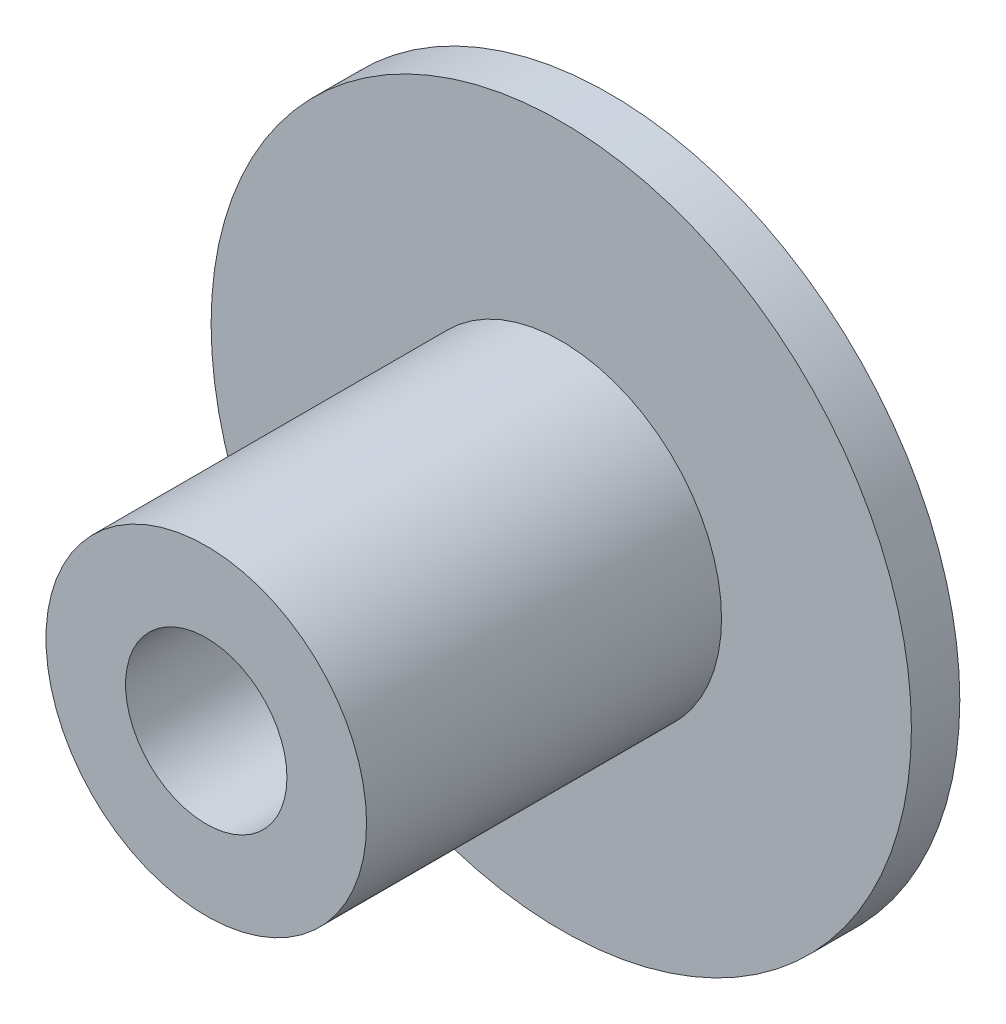
ISO-10303-21;
HEADER;
FILE_DESCRIPTION(('STEP AP214'),'2;1');
FILE_NAME('part.step','',(''),(''),'','','');
FILE_SCHEMA(('AUTOMOTIVE_DESIGN { 1 0 10303 214 1 1 1 1 }'));
ENDSEC;
DATA;
#1=APPLICATION_CONTEXT('core data for automotive mechanical design processes');
#2=APPLICATION_PROTOCOL_DEFINITION('international standard','automotive_design',2000,#1);
#3=PRODUCT_CONTEXT('',#1,'mechanical');
#4=PRODUCT('Part','Part','',(#3));
#5=PRODUCT_RELATED_PRODUCT_CATEGORY('part','',(#4));
#6=PRODUCT_DEFINITION_FORMATION('','',#4);
#7=PRODUCT_DEFINITION_CONTEXT('part definition',#1,'design');
#8=PRODUCT_DEFINITION('design','',#6,#7);
#9=PRODUCT_DEFINITION_SHAPE('','',#8);
#10=(LENGTH_UNIT() NAMED_UNIT(*) SI_UNIT(.MILLI.,.METRE.));
#11=(NAMED_UNIT(*) PLANE_ANGLE_UNIT() SI_UNIT($,.RADIAN.));
#12=(NAMED_UNIT(*) SI_UNIT($,.STERADIAN.) SOLID_ANGLE_UNIT());
#13=UNCERTAINTY_MEASURE_WITH_UNIT(LENGTH_MEASURE(1.E-05),#10,'distance_accuracy_value','');
#14=(GEOMETRIC_REPRESENTATION_CONTEXT(3) GLOBAL_UNCERTAINTY_ASSIGNED_CONTEXT((#13)) GLOBAL_UNIT_ASSIGNED_CONTEXT((#10,
#11,#12)) REPRESENTATION_CONTEXT('',''));
#15=CARTESIAN_POINT('',(0.,0.,0.));
#16=DIRECTION('',(0.,0.,1.));
#17=DIRECTION('',(1.,0.,0.));
#18=AXIS2_PLACEMENT_3D('',#15,#16,#17);
#19=CARTESIAN_POINT('',(0.,0.,4.5));
#20=DIRECTION('',(0.,0.,1.));
#21=DIRECTION('',(1.,0.,0.));
#22=AXIS2_PLACEMENT_3D('',#19,#20,#21);
#23=PLANE('',#22);
#24=CARTESIAN_POINT('',(0.,0.,4.5));
#25=DIRECTION('',(0.,0.,1.));
#26=DIRECTION('',(1.,0.,0.));
#27=AXIS2_PLACEMENT_3D('',#24,#25,#26);
#28=CIRCLE('',#27,32.55);
#29=CARTESIAN_POINT('',(32.55,0.,4.5));
#30=VERTEX_POINT('',#29);
#31=EDGE_CURVE('E10',#30,#30,#28,.T.);
#32=ORIENTED_EDGE('',*,*,#31,.T.);
#33=EDGE_LOOP('',(#32));
#34=FACE_BOUND('',#33,.T.);
#35=CARTESIAN_POINT('',(0.,0.,4.5));
#36=DIRECTION('',(0.,0.,1.));
#37=DIRECTION('',(1.,0.,0.));
#38=AXIS2_PLACEMENT_3D('',#35,#36,#37);
#39=CIRCLE('',#38,14.9);
#40=CARTESIAN_POINT('',(14.9,0.,4.5));
#41=VERTEX_POINT('',#40);
#42=EDGE_CURVE('E49',#41,#41,#39,.T.);
#43=ORIENTED_EDGE('',*,*,#42,.F.);
#44=EDGE_LOOP('',(#43));
#45=FACE_BOUND('',#44,.T.);
#46=ADVANCED_FACE('F33',(#34,#45),#23,.T.);
#47=CARTESIAN_POINT('',(0.,0.,0.));
#48=DIRECTION('',(0.,0.,1.));
#49=DIRECTION('',(1.,0.,0.));
#50=AXIS2_PLACEMENT_3D('',#47,#48,#49);
#51=PLANE('',#50);
#52=CARTESIAN_POINT('',(0.,0.,0.));
#53=DIRECTION('',(0.,0.,1.));
#54=DIRECTION('',(1.,0.,0.));
#55=AXIS2_PLACEMENT_3D('',#52,#53,#54);
#56=CIRCLE('',#55,32.55);
#57=CARTESIAN_POINT('',(32.55,0.,0.));
#58=VERTEX_POINT('',#57);
#59=EDGE_CURVE('E37',#58,#58,#56,.T.);
#60=ORIENTED_EDGE('',*,*,#59,.F.);
#61=EDGE_LOOP('',(#60));
#62=FACE_BOUND('',#61,.T.);
#63=CARTESIAN_POINT('',(0.,0.,0.));
#64=DIRECTION('',(0.,0.,1.));
#65=DIRECTION('',(1.,0.,0.));
#66=AXIS2_PLACEMENT_3D('',#63,#64,#65);
#67=CIRCLE('',#66,7.5);
#68=CARTESIAN_POINT('',(7.5,0.,0.));
#69=VERTEX_POINT('',#68);
#70=EDGE_CURVE('E44',#69,#69,#67,.T.);
#71=ORIENTED_EDGE('',*,*,#70,.T.);
#72=EDGE_LOOP('',(#71));
#73=FACE_BOUND('',#72,.T.);
#74=ADVANCED_FACE('F74',(#62,#73),#51,.F.);
#75=CARTESIAN_POINT('',(0.,0.,4.5));
#76=DIRECTION('',(0.,0.,-1.));
#77=DIRECTION('',(-1.,0.,0.));
#78=AXIS2_PLACEMENT_3D('',#75,#76,#77);
#79=CYLINDRICAL_SURFACE('',#78,32.55);
#80=ORIENTED_EDGE('',*,*,#31,.F.);
#81=EDGE_LOOP('',(#80));
#82=FACE_BOUND('',#81,.T.);
#83=ORIENTED_EDGE('',*,*,#59,.T.);
#84=EDGE_LOOP('',(#83));
#85=FACE_BOUND('',#84,.T.);
#86=ADVANCED_FACE('F35',(#82,#85),#79,.T.);
#87=CARTESIAN_POINT('',(0.,0.,4.5));
#88=DIRECTION('',(0.,0.,-1.));
#89=DIRECTION('',(-1.,0.,0.));
#90=AXIS2_PLACEMENT_3D('',#87,#88,#89);
#91=CYLINDRICAL_SURFACE('',#90,7.5);
#92=ORIENTED_EDGE('',*,*,#70,.F.);
#93=EDGE_LOOP('',(#92));
#94=FACE_BOUND('',#93,.T.);
#95=CARTESIAN_POINT('',(0.,0.,37.5));
#96=DIRECTION('',(0.,0.,1.));
#97=DIRECTION('',(1.,0.,0.));
#98=AXIS2_PLACEMENT_3D('',#95,#96,#97);
#99=CIRCLE('',#98,7.5);
#100=CARTESIAN_POINT('',(7.5,0.,37.5));
#101=VERTEX_POINT('',#100);
#102=EDGE_CURVE('E52',#101,#101,#99,.T.);
#103=ORIENTED_EDGE('',*,*,#102,.T.);
#104=EDGE_LOOP('',(#103));
#105=FACE_BOUND('',#104,.T.);
#106=ADVANCED_FACE('F58',(#94,#105),#91,.F.);
#107=CARTESIAN_POINT('',(0.,0.,37.5));
#108=DIRECTION('',(0.,0.,1.));
#109=DIRECTION('',(1.,0.,0.));
#110=AXIS2_PLACEMENT_3D('',#107,#108,#109);
#111=PLANE('',#110);
#112=CARTESIAN_POINT('',(0.,0.,37.5));
#113=DIRECTION('',(0.,0.,1.));
#114=DIRECTION('',(1.,0.,0.));
#115=AXIS2_PLACEMENT_3D('',#112,#113,#114);
#116=CIRCLE('',#115,14.9);
#117=CARTESIAN_POINT('',(14.9,0.,37.5));
#118=VERTEX_POINT('',#117);
#119=EDGE_CURVE('E48',#118,#118,#116,.T.);
#120=ORIENTED_EDGE('',*,*,#119,.T.);
#121=EDGE_LOOP('',(#120));
#122=FACE_BOUND('',#121,.T.);
#123=ORIENTED_EDGE('',*,*,#102,.F.);
#124=EDGE_LOOP('',(#123));
#125=FACE_BOUND('',#124,.T.);
#126=ADVANCED_FACE('F60',(#122,#125),#111,.T.);
#127=CARTESIAN_POINT('',(0.,0.,37.5));
#128=DIRECTION('',(0.,0.,-1.));
#129=DIRECTION('',(-1.,0.,0.));
#130=AXIS2_PLACEMENT_3D('',#127,#128,#129);
#131=CYLINDRICAL_SURFACE('',#130,14.9);
#132=ORIENTED_EDGE('',*,*,#119,.F.);
#133=EDGE_LOOP('',(#132));
#134=FACE_BOUND('',#133,.T.);
#135=ORIENTED_EDGE('',*,*,#42,.T.);
#136=EDGE_LOOP('',(#135));
#137=FACE_BOUND('',#136,.T.);
#138=ADVANCED_FACE('F62',(#134,#137),#131,.T.);
#139=CLOSED_SHELL('',(#46,#74,#86,#106,#126,#138));
#140=MANIFOLD_SOLID_BREP('B2',#139);
#141=ADVANCED_BREP_SHAPE_REPRESENTATION('',(#18,#140),#14);
#142=SHAPE_DEFINITION_REPRESENTATION(#9,#141);
ENDSEC;
END-ISO-10303-21;
